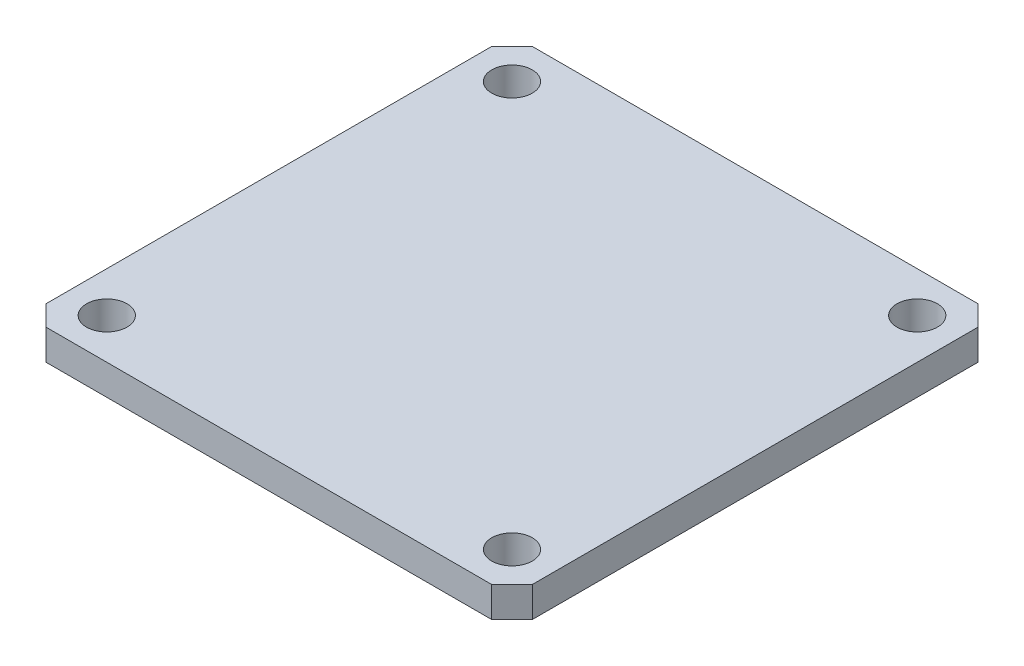
ISO-10303-21;
HEADER;
FILE_DESCRIPTION(('STEP AP214'),'2;1');
FILE_NAME('part.step','',(''),(''),'','','');
FILE_SCHEMA(('AUTOMOTIVE_DESIGN { 1 0 10303 214 1 1 1 1 }'));
ENDSEC;
DATA;
#1=APPLICATION_CONTEXT('core data for automotive mechanical design processes');
#2=APPLICATION_PROTOCOL_DEFINITION('international standard','automotive_design',2000,#1);
#3=PRODUCT_CONTEXT('',#1,'mechanical');
#4=PRODUCT('Part','Part','',(#3));
#5=PRODUCT_RELATED_PRODUCT_CATEGORY('part','',(#4));
#6=PRODUCT_DEFINITION_FORMATION('','',#4);
#7=PRODUCT_DEFINITION_CONTEXT('part definition',#1,'design');
#8=PRODUCT_DEFINITION('design','',#6,#7);
#9=PRODUCT_DEFINITION_SHAPE('','',#8);
#10=(LENGTH_UNIT() NAMED_UNIT(*) SI_UNIT(.MILLI.,.METRE.));
#11=(NAMED_UNIT(*) PLANE_ANGLE_UNIT() SI_UNIT($,.RADIAN.));
#12=(NAMED_UNIT(*) SI_UNIT($,.STERADIAN.) SOLID_ANGLE_UNIT());
#13=UNCERTAINTY_MEASURE_WITH_UNIT(LENGTH_MEASURE(1.E-05),#10,'distance_accuracy_value','');
#14=(GEOMETRIC_REPRESENTATION_CONTEXT(3) GLOBAL_UNCERTAINTY_ASSIGNED_CONTEXT((#13)) GLOBAL_UNIT_ASSIGNED_CONTEXT((#10,
#11,#12)) REPRESENTATION_CONTEXT('',''));
#15=CARTESIAN_POINT('',(0.,0.,0.));
#16=DIRECTION('',(0.,0.,1.));
#17=DIRECTION('',(1.,0.,0.));
#18=AXIS2_PLACEMENT_3D('',#15,#16,#17);
#19=CARTESIAN_POINT('',(-12.,1.5,12.));
#20=DIRECTION('',(1.,0.,0.));
#21=DIRECTION('',(0.,0.,-1.));
#22=AXIS2_PLACEMENT_3D('',#19,#20,#21);
#23=PLANE('',#22);
#24=DIRECTION('',(0.,0.,1.));
#25=VECTOR('',#24,1.);
#26=CARTESIAN_POINT('',(-12.,1.5,12.));
#27=LINE('',#26,#25);
#28=CARTESIAN_POINT('',(-12.,1.5,-11.));
#29=VERTEX_POINT('',#28);
#30=CARTESIAN_POINT('',(-12.,1.5,11.));
#31=VERTEX_POINT('',#30);
#32=EDGE_CURVE('E127',#29,#31,#27,.T.);
#33=ORIENTED_EDGE('',*,*,#32,.F.);
#34=DIRECTION('',(0.,-1.,0.));
#35=VECTOR('',#34,1.);
#36=CARTESIAN_POINT('',(-12.,1.5,-11.));
#37=LINE('',#36,#35);
#38=CARTESIAN_POINT('',(-12.,0.,-11.));
#39=VERTEX_POINT('',#38);
#40=EDGE_CURVE('E112',#29,#39,#37,.T.);
#41=ORIENTED_EDGE('',*,*,#40,.T.);
#42=DIRECTION('',(0.,0.,1.));
#43=VECTOR('',#42,1.);
#44=CARTESIAN_POINT('',(-12.,0.,12.));
#45=LINE('',#44,#43);
#46=CARTESIAN_POINT('',(-12.,0.,11.));
#47=VERTEX_POINT('',#46);
#48=EDGE_CURVE('E124',#39,#47,#45,.T.);
#49=ORIENTED_EDGE('',*,*,#48,.T.);
#50=DIRECTION('',(0.,1.,0.));
#51=VECTOR('',#50,1.);
#52=CARTESIAN_POINT('',(-12.,1.5,11.));
#53=LINE('',#52,#51);
#54=EDGE_CURVE('E129',#47,#31,#53,.T.);
#55=ORIENTED_EDGE('',*,*,#54,.T.);
#56=EDGE_LOOP('',(#33,#41,#49,#55));
#57=FACE_BOUND('',#56,.T.);
#58=ADVANCED_FACE('F40',(#57),#23,.F.);
#59=CARTESIAN_POINT('',(12.,1.5,12.));
#60=DIRECTION('',(0.,0.,-1.));
#61=DIRECTION('',(-1.,0.,0.));
#62=AXIS2_PLACEMENT_3D('',#59,#60,#61);
#63=PLANE('',#62);
#64=DIRECTION('',(1.,0.,0.));
#65=VECTOR('',#64,1.);
#66=CARTESIAN_POINT('',(12.,1.5,12.));
#67=LINE('',#66,#65);
#68=CARTESIAN_POINT('',(-11.,1.5,12.));
#69=VERTEX_POINT('',#68);
#70=CARTESIAN_POINT('',(11.,1.5,12.));
#71=VERTEX_POINT('',#70);
#72=EDGE_CURVE('E171',#69,#71,#67,.T.);
#73=ORIENTED_EDGE('',*,*,#72,.F.);
#74=DIRECTION('',(0.,-1.,0.));
#75=VECTOR('',#74,1.);
#76=CARTESIAN_POINT('',(-11.,1.5,12.));
#77=LINE('',#76,#75);
#78=CARTESIAN_POINT('',(-11.,0.,12.));
#79=VERTEX_POINT('',#78);
#80=EDGE_CURVE('E11',#69,#79,#77,.T.);
#81=ORIENTED_EDGE('',*,*,#80,.T.);
#82=DIRECTION('',(1.,0.,0.));
#83=VECTOR('',#82,1.);
#84=CARTESIAN_POINT('',(12.,0.,12.));
#85=LINE('',#84,#83);
#86=CARTESIAN_POINT('',(11.,0.,12.));
#87=VERTEX_POINT('',#86);
#88=EDGE_CURVE('E134',#79,#87,#85,.T.);
#89=ORIENTED_EDGE('',*,*,#88,.T.);
#90=DIRECTION('',(0.,1.,0.));
#91=VECTOR('',#90,1.);
#92=CARTESIAN_POINT('',(11.,1.5,12.));
#93=LINE('',#92,#91);
#94=EDGE_CURVE('E49',#87,#71,#93,.T.);
#95=ORIENTED_EDGE('',*,*,#94,.T.);
#96=EDGE_LOOP('',(#73,#81,#89,#95));
#97=FACE_BOUND('',#96,.T.);
#98=ADVANCED_FACE('F170',(#97),#63,.F.);
#99=CARTESIAN_POINT('',(12.,1.5,12.));
#100=DIRECTION('',(-1.,0.,0.));
#101=DIRECTION('',(0.,0.,1.));
#102=AXIS2_PLACEMENT_3D('',#99,#100,#101);
#103=PLANE('',#102);
#104=DIRECTION('',(0.,0.,-1.));
#105=VECTOR('',#104,1.);
#106=CARTESIAN_POINT('',(12.,0.,12.));
#107=LINE('',#106,#105);
#108=CARTESIAN_POINT('',(12.,0.,11.));
#109=VERTEX_POINT('',#108);
#110=CARTESIAN_POINT('',(12.,0.,-11.));
#111=VERTEX_POINT('',#110);
#112=EDGE_CURVE('E138',#109,#111,#107,.T.);
#113=ORIENTED_EDGE('',*,*,#112,.T.);
#114=DIRECTION('',(0.,1.,0.));
#115=VECTOR('',#114,1.);
#116=CARTESIAN_POINT('',(12.,1.5,-11.));
#117=LINE('',#116,#115);
#118=CARTESIAN_POINT('',(12.,1.5,-11.));
#119=VERTEX_POINT('',#118);
#120=EDGE_CURVE('E56',#111,#119,#117,.T.);
#121=ORIENTED_EDGE('',*,*,#120,.T.);
#122=DIRECTION('',(0.,0.,-1.));
#123=VECTOR('',#122,1.);
#124=CARTESIAN_POINT('',(12.,1.5,12.));
#125=LINE('',#124,#123);
#126=CARTESIAN_POINT('',(12.,1.5,11.));
#127=VERTEX_POINT('',#126);
#128=EDGE_CURVE('E177',#127,#119,#125,.T.);
#129=ORIENTED_EDGE('',*,*,#128,.F.);
#130=DIRECTION('',(0.,-1.,0.));
#131=VECTOR('',#130,1.);
#132=CARTESIAN_POINT('',(12.,1.5,11.));
#133=LINE('',#132,#131);
#134=EDGE_CURVE('E164',#127,#109,#133,.T.);
#135=ORIENTED_EDGE('',*,*,#134,.T.);
#136=EDGE_LOOP('',(#113,#121,#129,#135));
#137=FACE_BOUND('',#136,.T.);
#138=ADVANCED_FACE('F181',(#137),#103,.F.);
#139=CARTESIAN_POINT('',(12.,1.5,-12.));
#140=DIRECTION('',(0.,0.,1.));
#141=DIRECTION('',(1.,0.,0.));
#142=AXIS2_PLACEMENT_3D('',#139,#140,#141);
#143=PLANE('',#142);
#144=DIRECTION('',(-1.,0.,0.));
#145=VECTOR('',#144,1.);
#146=CARTESIAN_POINT('',(12.,0.,-12.));
#147=LINE('',#146,#145);
#148=CARTESIAN_POINT('',(11.,0.,-12.));
#149=VERTEX_POINT('',#148);
#150=CARTESIAN_POINT('',(-11.,0.,-12.));
#151=VERTEX_POINT('',#150);
#152=EDGE_CURVE('E148',#149,#151,#147,.T.);
#153=ORIENTED_EDGE('',*,*,#152,.T.);
#154=DIRECTION('',(0.,1.,0.));
#155=VECTOR('',#154,1.);
#156=CARTESIAN_POINT('',(-11.,1.5,-12.));
#157=LINE('',#156,#155);
#158=CARTESIAN_POINT('',(-11.,1.5,-12.));
#159=VERTEX_POINT('',#158);
#160=EDGE_CURVE('E113',#151,#159,#157,.T.);
#161=ORIENTED_EDGE('',*,*,#160,.T.);
#162=DIRECTION('',(-1.,0.,0.));
#163=VECTOR('',#162,1.);
#164=CARTESIAN_POINT('',(12.,1.5,-12.));
#165=LINE('',#164,#163);
#166=CARTESIAN_POINT('',(11.,1.5,-12.));
#167=VERTEX_POINT('',#166);
#168=EDGE_CURVE('E144',#167,#159,#165,.T.);
#169=ORIENTED_EDGE('',*,*,#168,.F.);
#170=DIRECTION('',(0.,-1.,0.));
#171=VECTOR('',#170,1.);
#172=CARTESIAN_POINT('',(11.,1.5,-12.));
#173=LINE('',#172,#171);
#174=EDGE_CURVE('E118',#167,#149,#173,.T.);
#175=ORIENTED_EDGE('',*,*,#174,.T.);
#176=EDGE_LOOP('',(#153,#161,#169,#175));
#177=FACE_BOUND('',#176,.T.);
#178=ADVANCED_FACE('F188',(#177),#143,.F.);
#179=CARTESIAN_POINT('',(0.,1.5,0.));
#180=DIRECTION('',(0.,1.,0.));
#181=DIRECTION('',(0.,0.,1.));
#182=AXIS2_PLACEMENT_3D('',#179,#180,#181);
#183=PLANE('',#182);
#184=CARTESIAN_POINT('',(-10.,1.5,10.));
#185=DIRECTION('',(0.,1.,0.));
#186=DIRECTION('',(0.,0.,1.));
#187=AXIS2_PLACEMENT_3D('',#184,#185,#186);
#188=CIRCLE('',#187,0.999999999999999);
#189=CARTESIAN_POINT('',(-10.,1.5,11.));
#190=VERTEX_POINT('',#189);
#191=EDGE_CURVE('E198',#190,#190,#188,.T.);
#192=ORIENTED_EDGE('',*,*,#191,.F.);
#193=EDGE_LOOP('',(#192));
#194=FACE_BOUND('',#193,.T.);
#195=CARTESIAN_POINT('',(10.,1.5,10.));
#196=DIRECTION('',(0.,1.,0.));
#197=DIRECTION('',(0.,0.,1.));
#198=AXIS2_PLACEMENT_3D('',#195,#196,#197);
#199=CIRCLE('',#198,0.999999999999999);
#200=CARTESIAN_POINT('',(10.,1.5,11.));
#201=VERTEX_POINT('',#200);
#202=EDGE_CURVE('E197',#201,#201,#199,.T.);
#203=ORIENTED_EDGE('',*,*,#202,.F.);
#204=EDGE_LOOP('',(#203));
#205=FACE_BOUND('',#204,.T.);
#206=CARTESIAN_POINT('',(10.,1.5,-10.));
#207=DIRECTION('',(0.,1.,0.));
#208=DIRECTION('',(0.,0.,1.));
#209=AXIS2_PLACEMENT_3D('',#206,#207,#208);
#210=CIRCLE('',#209,0.999999999999999);
#211=CARTESIAN_POINT('',(10.,1.5,-9.00000000000001));
#212=VERTEX_POINT('',#211);
#213=EDGE_CURVE('E204',#212,#212,#210,.T.);
#214=ORIENTED_EDGE('',*,*,#213,.F.);
#215=EDGE_LOOP('',(#214));
#216=FACE_BOUND('',#215,.T.);
#217=CARTESIAN_POINT('',(-10.,1.5,-10.));
#218=DIRECTION('',(0.,1.,0.));
#219=DIRECTION('',(0.,0.,1.));
#220=AXIS2_PLACEMENT_3D('',#217,#218,#219);
#221=CIRCLE('',#220,0.999999999999999);
#222=CARTESIAN_POINT('',(-10.,1.5,-9.));
#223=VERTEX_POINT('',#222);
#224=EDGE_CURVE('E141',#223,#223,#221,.T.);
#225=ORIENTED_EDGE('',*,*,#224,.F.);
#226=EDGE_LOOP('',(#225));
#227=FACE_BOUND('',#226,.T.);
#228=ORIENTED_EDGE('',*,*,#168,.T.);
#229=DIRECTION('',(0.707106781186548,0.,-0.707106781186548));
#230=VECTOR('',#229,1.);
#231=CARTESIAN_POINT('',(-11.5,1.5,-11.5));
#232=LINE('',#231,#230);
#233=EDGE_CURVE('E162',#159,#29,#232,.F.);
#234=ORIENTED_EDGE('',*,*,#233,.T.);
#235=ORIENTED_EDGE('',*,*,#32,.T.);
#236=DIRECTION('',(-0.707106781186548,0.,-0.707106781186548));
#237=VECTOR('',#236,1.);
#238=CARTESIAN_POINT('',(-11.5,1.5,11.5));
#239=LINE('',#238,#237);
#240=EDGE_CURVE('E158',#31,#69,#239,.F.);
#241=ORIENTED_EDGE('',*,*,#240,.T.);
#242=ORIENTED_EDGE('',*,*,#72,.T.);
#243=DIRECTION('',(-0.707106781186548,0.,0.707106781186548));
#244=VECTOR('',#243,1.);
#245=CARTESIAN_POINT('',(11.5,1.5,11.5));
#246=LINE('',#245,#244);
#247=EDGE_CURVE('E63',#71,#127,#246,.F.);
#248=ORIENTED_EDGE('',*,*,#247,.T.);
#249=ORIENTED_EDGE('',*,*,#128,.T.);
#250=DIRECTION('',(0.707106781186548,0.,0.707106781186548));
#251=VECTOR('',#250,1.);
#252=CARTESIAN_POINT('',(11.5,1.5,-11.5));
#253=LINE('',#252,#251);
#254=EDGE_CURVE('E160',#119,#167,#253,.F.);
#255=ORIENTED_EDGE('',*,*,#254,.T.);
#256=EDGE_LOOP('',(#228,#234,#235,#241,#242,#248,#249,#255));
#257=FACE_BOUND('',#256,.T.);
#258=ADVANCED_FACE('F175',(#194,#205,#216,#227,#257),#183,.T.);
#259=CARTESIAN_POINT('',(0.,0.,0.));
#260=DIRECTION('',(0.,1.,0.));
#261=DIRECTION('',(0.,0.,1.));
#262=AXIS2_PLACEMENT_3D('',#259,#260,#261);
#263=PLANE('',#262);
#264=CARTESIAN_POINT('',(-10.,0.,10.));
#265=DIRECTION('',(0.,1.,0.));
#266=DIRECTION('',(0.,0.,1.));
#267=AXIS2_PLACEMENT_3D('',#264,#265,#266);
#268=CIRCLE('',#267,0.999999999999999);
#269=CARTESIAN_POINT('',(-10.,0.,11.));
#270=VERTEX_POINT('',#269);
#271=EDGE_CURVE('E194',#270,#270,#268,.F.);
#272=ORIENTED_EDGE('',*,*,#271,.F.);
#273=EDGE_LOOP('',(#272));
#274=FACE_BOUND('',#273,.T.);
#275=CARTESIAN_POINT('',(10.,0.,10.));
#276=DIRECTION('',(0.,1.,0.));
#277=DIRECTION('',(0.,0.,1.));
#278=AXIS2_PLACEMENT_3D('',#275,#276,#277);
#279=CIRCLE('',#278,0.999999999999999);
#280=CARTESIAN_POINT('',(10.,0.,11.));
#281=VERTEX_POINT('',#280);
#282=EDGE_CURVE('E201',#281,#281,#279,.F.);
#283=ORIENTED_EDGE('',*,*,#282,.F.);
#284=EDGE_LOOP('',(#283));
#285=FACE_BOUND('',#284,.T.);
#286=CARTESIAN_POINT('',(10.,0.,-10.));
#287=DIRECTION('',(0.,1.,0.));
#288=DIRECTION('',(0.,0.,1.));
#289=AXIS2_PLACEMENT_3D('',#286,#287,#288);
#290=CIRCLE('',#289,0.999999999999999);
#291=CARTESIAN_POINT('',(10.,0.,-9.00000000000001));
#292=VERTEX_POINT('',#291);
#293=EDGE_CURVE('E193',#292,#292,#290,.F.);
#294=ORIENTED_EDGE('',*,*,#293,.F.);
#295=EDGE_LOOP('',(#294));
#296=FACE_BOUND('',#295,.T.);
#297=CARTESIAN_POINT('',(-10.,0.,-10.));
#298=DIRECTION('',(0.,1.,0.));
#299=DIRECTION('',(0.,0.,1.));
#300=AXIS2_PLACEMENT_3D('',#297,#298,#299);
#301=CIRCLE('',#300,0.999999999999999);
#302=CARTESIAN_POINT('',(-10.,0.,-9.));
#303=VERTEX_POINT('',#302);
#304=EDGE_CURVE('E135',#303,#303,#301,.F.);
#305=ORIENTED_EDGE('',*,*,#304,.F.);
#306=EDGE_LOOP('',(#305));
#307=FACE_BOUND('',#306,.T.);
#308=ORIENTED_EDGE('',*,*,#48,.F.);
#309=DIRECTION('',(-0.707106781186548,0.,0.707106781186548));
#310=VECTOR('',#309,1.);
#311=CARTESIAN_POINT('',(-12.,0.,-11.));
#312=LINE('',#311,#310);
#313=EDGE_CURVE('E108',#39,#151,#312,.F.);
#314=ORIENTED_EDGE('',*,*,#313,.T.);
#315=ORIENTED_EDGE('',*,*,#152,.F.);
#316=DIRECTION('',(-0.707106781186548,0.,-0.707106781186548));
#317=VECTOR('',#316,1.);
#318=CARTESIAN_POINT('',(11.,0.,-12.));
#319=LINE('',#318,#317);
#320=EDGE_CURVE('E119',#149,#111,#319,.F.);
#321=ORIENTED_EDGE('',*,*,#320,.T.);
#322=ORIENTED_EDGE('',*,*,#112,.F.);
#323=DIRECTION('',(0.707106781186548,0.,-0.707106781186548));
#324=VECTOR('',#323,1.);
#325=CARTESIAN_POINT('',(12.,0.,11.));
#326=LINE('',#325,#324);
#327=EDGE_CURVE('E128',#109,#87,#326,.F.);
#328=ORIENTED_EDGE('',*,*,#327,.T.);
#329=ORIENTED_EDGE('',*,*,#88,.F.);
#330=DIRECTION('',(0.707106781186548,0.,0.707106781186548));
#331=VECTOR('',#330,1.);
#332=CARTESIAN_POINT('',(-11.,0.,12.));
#333=LINE('',#332,#331);
#334=EDGE_CURVE('E133',#79,#47,#333,.F.);
#335=ORIENTED_EDGE('',*,*,#334,.T.);
#336=EDGE_LOOP('',(#308,#314,#315,#321,#322,#328,#329,#335));
#337=FACE_BOUND('',#336,.T.);
#338=ADVANCED_FACE('F131',(#274,#285,#296,#307,#337),#263,.F.);
#339=CARTESIAN_POINT('',(-12.,1.5,-11.));
#340=DIRECTION('',(0.707106781186547,0.,0.707106781186547));
#341=DIRECTION('',(0.,-1.,0.));
#342=AXIS2_PLACEMENT_3D('',#339,#340,#341);
#343=PLANE('',#342);
#344=ORIENTED_EDGE('',*,*,#233,.F.);
#345=ORIENTED_EDGE('',*,*,#160,.F.);
#346=ORIENTED_EDGE('',*,*,#313,.F.);
#347=ORIENTED_EDGE('',*,*,#40,.F.);
#348=EDGE_LOOP('',(#344,#345,#346,#347));
#349=FACE_BOUND('',#348,.T.);
#350=ADVANCED_FACE('F111',(#349),#343,.F.);
#351=CARTESIAN_POINT('',(11.,1.5,-12.));
#352=DIRECTION('',(-0.707106781186547,0.,0.707106781186547));
#353=DIRECTION('',(0.,-1.,0.));
#354=AXIS2_PLACEMENT_3D('',#351,#352,#353);
#355=PLANE('',#354);
#356=ORIENTED_EDGE('',*,*,#254,.F.);
#357=ORIENTED_EDGE('',*,*,#120,.F.);
#358=ORIENTED_EDGE('',*,*,#320,.F.);
#359=ORIENTED_EDGE('',*,*,#174,.F.);
#360=EDGE_LOOP('',(#356,#357,#358,#359));
#361=FACE_BOUND('',#360,.T.);
#362=ADVANCED_FACE('F185',(#361),#355,.F.);
#363=CARTESIAN_POINT('',(-11.,1.5,12.));
#364=DIRECTION('',(0.707106781186547,0.,-0.707106781186547));
#365=DIRECTION('',(0.,-1.,0.));
#366=AXIS2_PLACEMENT_3D('',#363,#364,#365);
#367=PLANE('',#366);
#368=ORIENTED_EDGE('',*,*,#240,.F.);
#369=ORIENTED_EDGE('',*,*,#54,.F.);
#370=ORIENTED_EDGE('',*,*,#334,.F.);
#371=ORIENTED_EDGE('',*,*,#80,.F.);
#372=EDGE_LOOP('',(#368,#369,#370,#371));
#373=FACE_BOUND('',#372,.T.);
#374=ADVANCED_FACE('F231',(#373),#367,.F.);
#375=CARTESIAN_POINT('',(12.,1.5,11.));
#376=DIRECTION('',(-0.707106781186548,0.,-0.707106781186548));
#377=DIRECTION('',(0.,-1.,0.));
#378=AXIS2_PLACEMENT_3D('',#375,#376,#377);
#379=PLANE('',#378);
#380=ORIENTED_EDGE('',*,*,#247,.F.);
#381=ORIENTED_EDGE('',*,*,#94,.F.);
#382=ORIENTED_EDGE('',*,*,#327,.F.);
#383=ORIENTED_EDGE('',*,*,#134,.F.);
#384=EDGE_LOOP('',(#380,#381,#382,#383));
#385=FACE_BOUND('',#384,.T.);
#386=ADVANCED_FACE('F43',(#385),#379,.F.);
#387=CARTESIAN_POINT('',(-10.,-2.82842712474619,-10.));
#388=DIRECTION('',(0.,1.,0.));
#389=DIRECTION('',(0.,0.,1.));
#390=AXIS2_PLACEMENT_3D('',#387,#388,#389);
#391=CYLINDRICAL_SURFACE('',#390,0.999999999999999);
#392=ORIENTED_EDGE('',*,*,#304,.T.);
#393=EDGE_LOOP('',(#392));
#394=FACE_BOUND('',#393,.T.);
#395=ORIENTED_EDGE('',*,*,#224,.T.);
#396=EDGE_LOOP('',(#395));
#397=FACE_BOUND('',#396,.T.);
#398=ADVANCED_FACE('F220',(#394,#397),#391,.F.);
#399=CARTESIAN_POINT('',(10.,-2.82842712474619,-10.));
#400=DIRECTION('',(0.,1.,0.));
#401=DIRECTION('',(0.,0.,1.));
#402=AXIS2_PLACEMENT_3D('',#399,#400,#401);
#403=CYLINDRICAL_SURFACE('',#402,0.999999999999999);
#404=ORIENTED_EDGE('',*,*,#293,.T.);
#405=EDGE_LOOP('',(#404));
#406=FACE_BOUND('',#405,.T.);
#407=ORIENTED_EDGE('',*,*,#213,.T.);
#408=EDGE_LOOP('',(#407));
#409=FACE_BOUND('',#408,.T.);
#410=ADVANCED_FACE('F212',(#406,#409),#403,.F.);
#411=CARTESIAN_POINT('',(10.,-2.82842712474619,10.));
#412=DIRECTION('',(0.,1.,0.));
#413=DIRECTION('',(0.,0.,1.));
#414=AXIS2_PLACEMENT_3D('',#411,#412,#413);
#415=CYLINDRICAL_SURFACE('',#414,0.999999999999999);
#416=ORIENTED_EDGE('',*,*,#282,.T.);
#417=EDGE_LOOP('',(#416));
#418=FACE_BOUND('',#417,.T.);
#419=ORIENTED_EDGE('',*,*,#202,.T.);
#420=EDGE_LOOP('',(#419));
#421=FACE_BOUND('',#420,.T.);
#422=ADVANCED_FACE('F228',(#418,#421),#415,.F.);
#423=CARTESIAN_POINT('',(-10.,-2.82842712474619,10.));
#424=DIRECTION('',(0.,1.,0.));
#425=DIRECTION('',(0.,0.,1.));
#426=AXIS2_PLACEMENT_3D('',#423,#424,#425);
#427=CYLINDRICAL_SURFACE('',#426,0.999999999999999);
#428=ORIENTED_EDGE('',*,*,#271,.T.);
#429=EDGE_LOOP('',(#428));
#430=FACE_BOUND('',#429,.T.);
#431=ORIENTED_EDGE('',*,*,#191,.T.);
#432=EDGE_LOOP('',(#431));
#433=FACE_BOUND('',#432,.T.);
#434=ADVANCED_FACE('F300',(#430,#433),#427,.F.);
#435=CLOSED_SHELL('',(#58,#98,#138,#178,#258,#338,#350,#362,#374,#386,#398,#410,#422,#434));
#436=MANIFOLD_SOLID_BREP('B2',#435);
#437=ADVANCED_BREP_SHAPE_REPRESENTATION('',(#18,#436),#14);
#438=SHAPE_DEFINITION_REPRESENTATION(#9,#437);
ENDSEC;
END-ISO-10303-21;
